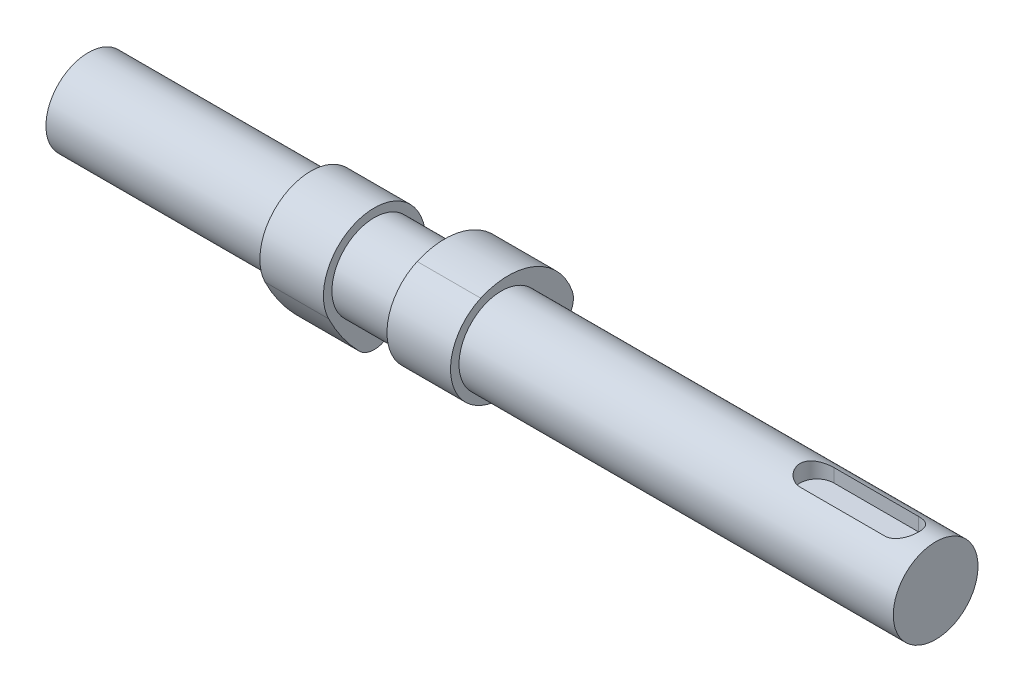
ISO-10303-21;
HEADER;
FILE_DESCRIPTION(('STEP AP214'),'2;1');
FILE_NAME('part.step','',(''),(''),'','','');
FILE_SCHEMA(('AUTOMOTIVE_DESIGN { 1 0 10303 214 1 1 1 1 }'));
ENDSEC;
DATA;
#1=APPLICATION_CONTEXT('core data for automotive mechanical design processes');
#2=APPLICATION_PROTOCOL_DEFINITION('international standard','automotive_design',2000,#1);
#3=PRODUCT_CONTEXT('',#1,'mechanical');
#4=PRODUCT('Part','Part','',(#3));
#5=PRODUCT_RELATED_PRODUCT_CATEGORY('part','',(#4));
#6=PRODUCT_DEFINITION_FORMATION('','',#4);
#7=PRODUCT_DEFINITION_CONTEXT('part definition',#1,'design');
#8=PRODUCT_DEFINITION('design','',#6,#7);
#9=PRODUCT_DEFINITION_SHAPE('','',#8);
#10=(LENGTH_UNIT() NAMED_UNIT(*) SI_UNIT(.MILLI.,.METRE.));
#11=(NAMED_UNIT(*) PLANE_ANGLE_UNIT() SI_UNIT($,.RADIAN.));
#12=(NAMED_UNIT(*) SI_UNIT($,.STERADIAN.) SOLID_ANGLE_UNIT());
#13=UNCERTAINTY_MEASURE_WITH_UNIT(LENGTH_MEASURE(1.E-05),#10,'distance_accuracy_value','');
#14=(GEOMETRIC_REPRESENTATION_CONTEXT(3) GLOBAL_UNCERTAINTY_ASSIGNED_CONTEXT((#13)) GLOBAL_UNIT_ASSIGNED_CONTEXT((#10,
#11,#12)) REPRESENTATION_CONTEXT('',''));
#15=CARTESIAN_POINT('',(0.,0.,0.));
#16=DIRECTION('',(0.,0.,1.));
#17=DIRECTION('',(1.,0.,0.));
#18=AXIS2_PLACEMENT_3D('',#15,#16,#17);
#19=CARTESIAN_POINT('',(-22.5,-1.62236318948023,3.65621904177246));
#20=DIRECTION('',(1.,0.,0.));
#21=DIRECTION('',(0.,1.,0.));
#22=AXIS2_PLACEMENT_3D('',#19,#20,#21);
#23=CYLINDRICAL_SURFACE('',#22,16.);
#24=CARTESIAN_POINT('',(-7.5,-1.62236318948023,3.65621904177246));
#25=DIRECTION('',(1.,0.,0.));
#26=DIRECTION('',(0.,1.,0.));
#27=AXIS2_PLACEMENT_3D('',#24,#25,#26);
#28=CIRCLE('',#27,16.);
#29=CARTESIAN_POINT('',(-7.5,-16.7126720366766,-1.66191774626015));
#30=VERTEX_POINT('',#29);
#31=CARTESIAN_POINT('',(-7.5,4.86708956844068,-10.9686571253174));
#32=VERTEX_POINT('',#31);
#33=EDGE_CURVE('E113',#30,#32,#28,.T.);
#34=ORIENTED_EDGE('',*,*,#33,.F.);
#35=DIRECTION('',(1.,0.,0.));
#36=VECTOR('',#35,1.);
#37=CARTESIAN_POINT('',(-22.5,-16.7126720366766,-1.66191774626015));
#38=LINE('',#37,#36);
#39=CARTESIAN_POINT('',(-22.5,-16.7126720366766,-1.66191774626015));
#40=VERTEX_POINT('',#39);
#41=EDGE_CURVE('E112',#40,#30,#38,.T.);
#42=ORIENTED_EDGE('',*,*,#41,.F.);
#43=CARTESIAN_POINT('',(-22.5,-1.62236318948023,3.65621904177246));
#44=DIRECTION('',(1.,0.,0.));
#45=DIRECTION('',(0.,1.,0.));
#46=AXIS2_PLACEMENT_3D('',#43,#44,#45);
#47=CIRCLE('',#46,16.);
#48=CARTESIAN_POINT('',(-22.5,4.86708956844068,-10.9686571253174));
#49=VERTEX_POINT('',#48);
#50=EDGE_CURVE('E107',#40,#49,#47,.T.);
#51=ORIENTED_EDGE('',*,*,#50,.T.);
#52=DIRECTION('',(1.,0.,0.));
#53=VECTOR('',#52,1.);
#54=CARTESIAN_POINT('',(-22.5,4.86708956844068,-10.9686571253174));
#55=LINE('',#54,#53);
#56=EDGE_CURVE('E12',#49,#32,#55,.T.);
#57=ORIENTED_EDGE('',*,*,#56,.T.);
#58=EDGE_LOOP('',(#34,#42,#51,#57));
#59=FACE_BOUND('',#58,.T.);
#60=ADVANCED_FACE('F50',(#59),#23,.T.);
#61=CARTESIAN_POINT('',(-22.5,0.,0.));
#62=DIRECTION('',(1.,0.,0.));
#63=DIRECTION('',(0.,1.,0.));
#64=AXIS2_PLACEMENT_3D('',#61,#62,#63);
#65=CYLINDRICAL_SURFACE('',#64,12.);
#66=CARTESIAN_POINT('',(-7.5,0.,0.));
#67=DIRECTION('',(1.,0.,0.));
#68=DIRECTION('',(0.,-1.,0.));
#69=AXIS2_PLACEMENT_3D('',#66,#67,#68);
#70=CIRCLE('',#69,12.);
#71=CARTESIAN_POINT('',(-7.5,-5.30622661682884,10.7630831591537));
#72=VERTEX_POINT('',#71);
#73=EDGE_CURVE('E115',#32,#72,#70,.T.);
#74=ORIENTED_EDGE('',*,*,#73,.F.);
#75=ORIENTED_EDGE('',*,*,#56,.F.);
#76=CARTESIAN_POINT('',(-22.5,0.,0.));
#77=DIRECTION('',(1.,0.,0.));
#78=DIRECTION('',(0.,-1.,0.));
#79=AXIS2_PLACEMENT_3D('',#76,#77,#78);
#80=CIRCLE('',#79,12.);
#81=CARTESIAN_POINT('',(-22.5,-5.30622661682884,10.7630831591537));
#82=VERTEX_POINT('',#81);
#83=EDGE_CURVE('E91',#49,#82,#80,.T.);
#84=ORIENTED_EDGE('',*,*,#83,.T.);
#85=DIRECTION('',(1.,0.,0.));
#86=VECTOR('',#85,1.);
#87=CARTESIAN_POINT('',(-22.5,-5.30622661682884,10.7630831591537));
#88=LINE('',#87,#86);
#89=EDGE_CURVE('E58',#82,#72,#88,.T.);
#90=ORIENTED_EDGE('',*,*,#89,.T.);
#91=EDGE_LOOP('',(#74,#75,#84,#90));
#92=FACE_BOUND('',#91,.T.);
#93=ADVANCED_FACE('F105',(#92),#65,.T.);
#94=CARTESIAN_POINT('',(-22.5,12.3811954392673,-25.1138607046919));
#95=DIRECTION('',(1.,0.,0.));
#96=DIRECTION('',(0.,1.,0.));
#97=AXIS2_PLACEMENT_3D('',#94,#95,#96);
#98=CYLINDRICAL_SURFACE('',#97,40.);
#99=CARTESIAN_POINT('',(-7.5,12.3811954392673,-25.1138607046919));
#100=DIRECTION('',(1.,0.,0.));
#101=DIRECTION('',(0.,-1.,0.));
#102=AXIS2_PLACEMENT_3D('',#99,#100,#101);
#103=CIRCLE('',#102,40.);
#104=CARTESIAN_POINT('',(-7.5,-15.4795428020985,3.58769438638459));
#105=VERTEX_POINT('',#104);
#106=EDGE_CURVE('E101',#72,#105,#103,.T.);
#107=ORIENTED_EDGE('',*,*,#106,.F.);
#108=ORIENTED_EDGE('',*,*,#89,.F.);
#109=CARTESIAN_POINT('',(-22.5,12.3811954392673,-25.1138607046919));
#110=DIRECTION('',(1.,0.,0.));
#111=DIRECTION('',(0.,-1.,0.));
#112=AXIS2_PLACEMENT_3D('',#109,#110,#111);
#113=CIRCLE('',#112,40.);
#114=CARTESIAN_POINT('',(-22.5,-15.4795428020985,3.58769438638459));
#115=VERTEX_POINT('',#114);
#116=EDGE_CURVE('E94',#82,#115,#113,.T.);
#117=ORIENTED_EDGE('',*,*,#116,.T.);
#118=DIRECTION('',(1.,0.,0.));
#119=VECTOR('',#118,1.);
#120=CARTESIAN_POINT('',(-22.5,-15.4795428020985,3.58769438638459));
#121=LINE('',#120,#119);
#122=EDGE_CURVE('E104',#115,#105,#121,.T.);
#123=ORIENTED_EDGE('',*,*,#122,.T.);
#124=EDGE_LOOP('',(#107,#108,#117,#123));
#125=FACE_BOUND('',#124,.T.);
#126=ADVANCED_FACE('F100',(#125),#98,.T.);
#127=CARTESIAN_POINT('',(-22.5,-11.9969505219278,0.));
#128=DIRECTION('',(1.,0.,0.));
#129=DIRECTION('',(0.,1.,0.));
#130=AXIS2_PLACEMENT_3D('',#127,#128,#129);
#131=CYLINDRICAL_SURFACE('',#130,5.);
#132=CARTESIAN_POINT('',(-7.5,-11.9969505219278,0.));
#133=DIRECTION('',(1.,0.,0.));
#134=DIRECTION('',(0.,-1.,0.));
#135=AXIS2_PLACEMENT_3D('',#132,#133,#134);
#136=CIRCLE('',#135,5.);
#137=EDGE_CURVE('E80',#105,#30,#136,.T.);
#138=ORIENTED_EDGE('',*,*,#137,.F.);
#139=ORIENTED_EDGE('',*,*,#122,.F.);
#140=CARTESIAN_POINT('',(-22.5,-11.9969505219278,0.));
#141=DIRECTION('',(1.,0.,0.));
#142=DIRECTION('',(0.,-1.,0.));
#143=AXIS2_PLACEMENT_3D('',#140,#141,#142);
#144=CIRCLE('',#143,5.);
#145=EDGE_CURVE('E66',#115,#40,#144,.T.);
#146=ORIENTED_EDGE('',*,*,#145,.T.);
#147=ORIENTED_EDGE('',*,*,#41,.T.);
#148=EDGE_LOOP('',(#138,#139,#146,#147));
#149=FACE_BOUND('',#148,.T.);
#150=ADVANCED_FACE('F124',(#149),#131,.T.);
#151=CARTESIAN_POINT('',(-22.5,-6.80965685570399,1.82810952088625));
#152=DIRECTION('',(1.,0.,0.));
#153=DIRECTION('',(0.,1.,0.));
#154=AXIS2_PLACEMENT_3D('',#151,#152,#153);
#155=PLANE('',#154);
#156=ORIENTED_EDGE('',*,*,#50,.F.);
#157=ORIENTED_EDGE('',*,*,#145,.F.);
#158=ORIENTED_EDGE('',*,*,#116,.F.);
#159=ORIENTED_EDGE('',*,*,#83,.F.);
#160=EDGE_LOOP('',(#156,#157,#158,#159));
#161=FACE_BOUND('',#160,.T.);
#162=ADVANCED_FACE('F96',(#161),#155,.F.);
#163=CARTESIAN_POINT('',(-7.5,-6.80965685570399,1.82810952088625));
#164=DIRECTION('',(1.,0.,0.));
#165=DIRECTION('',(0.,1.,0.));
#166=AXIS2_PLACEMENT_3D('',#163,#164,#165);
#167=PLANE('',#166);
#168=ORIENTED_EDGE('',*,*,#33,.T.);
#169=ORIENTED_EDGE('',*,*,#73,.T.);
#170=ORIENTED_EDGE('',*,*,#106,.T.);
#171=ORIENTED_EDGE('',*,*,#137,.T.);
#172=EDGE_LOOP('',(#168,#169,#170,#171));
#173=FACE_BOUND('',#172,.T.);
#174=ADVANCED_FACE('F120',(#173),#167,.T.);
#175=CLOSED_SHELL('',(#60,#93,#126,#150,#162,#174));
#176=MANIFOLD_SOLID_BREP('B2',#175);
#177=CARTESIAN_POINT('',(22.5,-3.65621904177246,-1.62236318948024));
#178=DIRECTION('',(-1.,0.,0.));
#179=DIRECTION('',(0.,0.,1.));
#180=AXIS2_PLACEMENT_3D('',#177,#178,#179);
#181=CYLINDRICAL_SURFACE('',#180,16.);
#182=CARTESIAN_POINT('',(7.5,-3.65621904177246,-1.62236318948024));
#183=DIRECTION('',(1.,0.,0.));
#184=DIRECTION('',(0.,0.,1.));
#185=AXIS2_PLACEMENT_3D('',#182,#183,#184);
#186=CIRCLE('',#185,16.);
#187=CARTESIAN_POINT('',(7.5,1.6619177462602,-16.7126720366766));
#188=VERTEX_POINT('',#187);
#189=CARTESIAN_POINT('',(7.5,10.9686571253174,4.86708956844072));
#190=VERTEX_POINT('',#189);
#191=EDGE_CURVE('E246',#188,#190,#186,.T.);
#192=ORIENTED_EDGE('',*,*,#191,.T.);
#193=DIRECTION('',(-1.,0.,0.));
#194=VECTOR('',#193,1.);
#195=CARTESIAN_POINT('',(22.5,10.9686571253174,4.86708956844072));
#196=LINE('',#195,#194);
#197=CARTESIAN_POINT('',(22.5,10.9686571253174,4.86708956844072));
#198=VERTEX_POINT('',#197);
#199=EDGE_CURVE('E48',#198,#190,#196,.T.);
#200=ORIENTED_EDGE('',*,*,#199,.F.);
#201=CARTESIAN_POINT('',(22.5,-3.65621904177246,-1.62236318948024));
#202=DIRECTION('',(1.,0.,0.));
#203=DIRECTION('',(0.,0.,1.));
#204=AXIS2_PLACEMENT_3D('',#201,#202,#203);
#205=CIRCLE('',#204,16.);
#206=CARTESIAN_POINT('',(22.5,1.6619177462602,-16.7126720366766));
#207=VERTEX_POINT('',#206);
#208=EDGE_CURVE('E234',#207,#198,#205,.T.);
#209=ORIENTED_EDGE('',*,*,#208,.F.);
#210=DIRECTION('',(-1.,0.,0.));
#211=VECTOR('',#210,1.);
#212=CARTESIAN_POINT('',(22.5,1.6619177462602,-16.7126720366766));
#213=LINE('',#212,#211);
#214=EDGE_CURVE('E242',#207,#188,#213,.T.);
#215=ORIENTED_EDGE('',*,*,#214,.T.);
#216=EDGE_LOOP('',(#192,#200,#209,#215));
#217=FACE_BOUND('',#216,.T.);
#218=ADVANCED_FACE('F183',(#217),#181,.T.);
#219=CARTESIAN_POINT('',(22.5,0.,0.));
#220=DIRECTION('',(-1.,0.,0.));
#221=DIRECTION('',(0.,0.,1.));
#222=AXIS2_PLACEMENT_3D('',#219,#220,#221);
#223=CYLINDRICAL_SURFACE('',#222,12.);
#224=CARTESIAN_POINT('',(7.5,0.,0.));
#225=DIRECTION('',(1.,0.,0.));
#226=DIRECTION('',(0.,0.,-1.));
#227=AXIS2_PLACEMENT_3D('',#224,#225,#226);
#228=CIRCLE('',#227,12.);
#229=CARTESIAN_POINT('',(7.5,-10.7630831591536,-5.30622661682888));
#230=VERTEX_POINT('',#229);
#231=EDGE_CURVE('E238',#190,#230,#228,.T.);
#232=ORIENTED_EDGE('',*,*,#231,.T.);
#233=DIRECTION('',(-1.,0.,0.));
#234=VECTOR('',#233,1.);
#235=CARTESIAN_POINT('',(22.5,-10.7630831591536,-5.30622661682888));
#236=LINE('',#235,#234);
#237=CARTESIAN_POINT('',(22.5,-10.7630831591536,-5.30622661682888));
#238=VERTEX_POINT('',#237);
#239=EDGE_CURVE('E191',#238,#230,#236,.T.);
#240=ORIENTED_EDGE('',*,*,#239,.F.);
#241=CARTESIAN_POINT('',(22.5,0.,0.));
#242=DIRECTION('',(1.,0.,0.));
#243=DIRECTION('',(0.,0.,-1.));
#244=AXIS2_PLACEMENT_3D('',#241,#242,#243);
#245=CIRCLE('',#244,12.);
#246=EDGE_CURVE('E229',#198,#238,#245,.T.);
#247=ORIENTED_EDGE('',*,*,#246,.F.);
#248=ORIENTED_EDGE('',*,*,#199,.T.);
#249=EDGE_LOOP('',(#232,#240,#247,#248));
#250=FACE_BOUND('',#249,.T.);
#251=ADVANCED_FACE('F237',(#250),#223,.T.);
#252=CARTESIAN_POINT('',(22.5,25.1138607046918,12.3811954392674));
#253=DIRECTION('',(-1.,0.,0.));
#254=DIRECTION('',(0.,0.,1.));
#255=AXIS2_PLACEMENT_3D('',#252,#253,#254);
#256=CYLINDRICAL_SURFACE('',#255,40.);
#257=CARTESIAN_POINT('',(7.5,25.1138607046918,12.3811954392674));
#258=DIRECTION('',(1.,0.,0.));
#259=DIRECTION('',(0.,0.,-1.));
#260=AXIS2_PLACEMENT_3D('',#257,#258,#259);
#261=CIRCLE('',#260,40.);
#262=CARTESIAN_POINT('',(7.5,-3.58769438638454,-15.4795428020985));
#263=VERTEX_POINT('',#262);
#264=EDGE_CURVE('E216',#230,#263,#261,.T.);
#265=ORIENTED_EDGE('',*,*,#264,.T.);
#266=DIRECTION('',(-1.,0.,0.));
#267=VECTOR('',#266,1.);
#268=CARTESIAN_POINT('',(22.5,-3.58769438638454,-15.4795428020985));
#269=LINE('',#268,#267);
#270=CARTESIAN_POINT('',(22.5,-3.58769438638454,-15.4795428020985));
#271=VERTEX_POINT('',#270);
#272=EDGE_CURVE('E239',#271,#263,#269,.T.);
#273=ORIENTED_EDGE('',*,*,#272,.F.);
#274=CARTESIAN_POINT('',(22.5,25.1138607046918,12.3811954392674));
#275=DIRECTION('',(1.,0.,0.));
#276=DIRECTION('',(0.,0.,-1.));
#277=AXIS2_PLACEMENT_3D('',#274,#275,#276);
#278=CIRCLE('',#277,40.);
#279=EDGE_CURVE('E232',#238,#271,#278,.T.);
#280=ORIENTED_EDGE('',*,*,#279,.F.);
#281=ORIENTED_EDGE('',*,*,#239,.T.);
#282=EDGE_LOOP('',(#265,#273,#280,#281));
#283=FACE_BOUND('',#282,.T.);
#284=ADVANCED_FACE('F240',(#283),#256,.T.);
#285=CARTESIAN_POINT('',(22.5,0.,-11.9969505219278));
#286=DIRECTION('',(-1.,0.,0.));
#287=DIRECTION('',(0.,0.,1.));
#288=AXIS2_PLACEMENT_3D('',#285,#286,#287);
#289=CYLINDRICAL_SURFACE('',#288,5.);
#290=CARTESIAN_POINT('',(7.5,0.,-11.9969505219278));
#291=DIRECTION('',(1.,0.,0.));
#292=DIRECTION('',(0.,0.,-1.));
#293=AXIS2_PLACEMENT_3D('',#290,#291,#292);
#294=CIRCLE('',#293,5.);
#295=EDGE_CURVE('E222',#263,#188,#294,.T.);
#296=ORIENTED_EDGE('',*,*,#295,.T.);
#297=ORIENTED_EDGE('',*,*,#214,.F.);
#298=CARTESIAN_POINT('',(22.5,0.,-11.9969505219278));
#299=DIRECTION('',(1.,0.,0.));
#300=DIRECTION('',(0.,0.,-1.));
#301=AXIS2_PLACEMENT_3D('',#298,#299,#300);
#302=CIRCLE('',#301,5.);
#303=EDGE_CURVE('E199',#271,#207,#302,.T.);
#304=ORIENTED_EDGE('',*,*,#303,.F.);
#305=ORIENTED_EDGE('',*,*,#272,.T.);
#306=EDGE_LOOP('',(#296,#297,#304,#305));
#307=FACE_BOUND('',#306,.T.);
#308=ADVANCED_FACE('F253',(#307),#289,.T.);
#309=CARTESIAN_POINT('',(22.5,-1.82810952088623,-6.809656855704));
#310=DIRECTION('',(-1.,0.,0.));
#311=DIRECTION('',(0.,0.,1.));
#312=AXIS2_PLACEMENT_3D('',#309,#310,#311);
#313=PLANE('',#312);
#314=ORIENTED_EDGE('',*,*,#208,.T.);
#315=ORIENTED_EDGE('',*,*,#246,.T.);
#316=ORIENTED_EDGE('',*,*,#279,.T.);
#317=ORIENTED_EDGE('',*,*,#303,.T.);
#318=EDGE_LOOP('',(#314,#315,#316,#317));
#319=FACE_BOUND('',#318,.T.);
#320=ADVANCED_FACE('F230',(#319),#313,.F.);
#321=CARTESIAN_POINT('',(7.5,-1.82810952088623,-6.809656855704));
#322=DIRECTION('',(-1.,0.,0.));
#323=DIRECTION('',(0.,0.,1.));
#324=AXIS2_PLACEMENT_3D('',#321,#322,#323);
#325=PLANE('',#324);
#326=ORIENTED_EDGE('',*,*,#191,.F.);
#327=ORIENTED_EDGE('',*,*,#295,.F.);
#328=ORIENTED_EDGE('',*,*,#264,.F.);
#329=ORIENTED_EDGE('',*,*,#231,.F.);
#330=EDGE_LOOP('',(#326,#327,#328,#329));
#331=FACE_BOUND('',#330,.T.);
#332=ADVANCED_FACE('F256',(#331),#325,.T.);
#333=CLOSED_SHELL('',(#218,#251,#284,#308,#320,#332));
#334=MANIFOLD_SOLID_BREP('B6',#333);
#335=CARTESIAN_POINT('',(125.,0.,0.));
#336=DIRECTION('',(-1.,0.,0.));
#337=DIRECTION('',(0.,0.,1.));
#338=AXIS2_PLACEMENT_3D('',#335,#336,#337);
#339=CYLINDRICAL_SURFACE('',#338,10.);
#340=DIRECTION('',(-1.,0.,0.));
#341=VECTOR('',#340,1.);
#342=CARTESIAN_POINT('',(125.,9.16515138991168,-4.));
#343=LINE('',#342,#341);
#344=CARTESIAN_POINT('',(97.,9.16515138991168,-4.));
#345=VERTEX_POINT('',#344);
#346=CARTESIAN_POINT('',(117.,9.16515138991168,-4.));
#347=VERTEX_POINT('',#346);
#348=EDGE_CURVE('E181',#345,#347,#343,.F.);
#349=ORIENTED_EDGE('',*,*,#348,.T.);
#350=CARTESIAN_POINT('',(117.,9.16515138991167,-4.00000000000002));
#351=CARTESIAN_POINT('',(117.107611705054,9.16512928809543,-4.00001596071939));
#352=CARTESIAN_POINT('',(117.215211331167,9.16704612011428,-3.99565782731267));
#353=CARTESIAN_POINT('',(117.429542596539,9.17459250745477,-3.97831811946461));
#354=CARTESIAN_POINT('',(117.536274550717,9.18022064873057,-3.96533982937532));
#355=CARTESIAN_POINT('',(117.747693643106,9.19499565865171,-3.93095207352901));
#356=CARTESIAN_POINT('',(117.852387168085,9.2041286144161,-3.90957593640918));
#357=CARTESIAN_POINT('',(118.059401543432,9.22560106586817,-3.85863260381274));
#358=CARTESIAN_POINT('',(118.161722248555,9.23794075728508,-3.82906490834149));
#359=CARTESIAN_POINT('',(118.463871701162,9.27918582501409,-3.72853943587113));
#360=CARTESIAN_POINT('',(118.659308461383,9.31234898316149,-3.64568978920224));
#361=CARTESIAN_POINT('',(119.033591160162,9.38624741529468,-3.45096383184149));
#362=CARTESIAN_POINT('',(119.212421105909,9.42698987727425,-3.33905992673096));
#363=CARTESIAN_POINT('',(119.558524793364,9.51401998804846,-3.08263671474508));
#364=CARTESIAN_POINT('',(119.7247344339,9.56048491272143,-2.93673827988503));
#365=CARTESIAN_POINT('',(120.031080544361,9.65225581096199,-2.6193929234938));
#366=CARTESIAN_POINT('',(120.171211661507,9.69756154495612,-2.44794076988));
#367=CARTESIAN_POINT('',(120.426812788624,9.78406834216144,-2.07601181629755));
#368=CARTESIAN_POINT('',(120.54108961941,9.82503649102095,-1.87465586655104));
#369=CARTESIAN_POINT('',(120.733688144491,9.89607888234979,-1.45364828604454));
#370=CARTESIAN_POINT('',(120.812024844793,9.92615767032247,-1.23400433637533));
#371=CARTESIAN_POINT('',(120.926682405771,9.97076629361036,-0.793934884187391));
#372=CARTESIAN_POINT('',(120.964853913303,9.98597845290694,-0.574062114869041));
#373=CARTESIAN_POINT('',(121.004056948403,10.001606202074,-0.130536855092222));
#374=CARTESIAN_POINT('',(121.005101633252,10.0020270338048,0.093114268252662));
#375=CARTESIAN_POINT('',(120.971034362072,9.98843920775428,0.524466731987217));
#376=CARTESIAN_POINT('',(120.937950053447,9.97523973659777,0.732358330632738));
#377=CARTESIAN_POINT('',(120.84001299909,9.93698538393897,1.13934964738687));
#378=CARTESIAN_POINT('',(120.77515845543,9.91192983148495,1.33844886722557));
#379=CARTESIAN_POINT('',(120.614727962228,9.85193670608706,1.72579479688347));
#380=CARTESIAN_POINT('',(120.518703604161,9.81685584875391,1.91383264586889));
#381=CARTESIAN_POINT('',(120.299068736295,9.74029168639969,2.27161599563069));
#382=CARTESIAN_POINT('',(120.175448548562,9.69880613681325,2.44135504792268));
#383=CARTESIAN_POINT('',(119.894719942564,9.61043706268123,2.76952257830688));
#384=CARTESIAN_POINT('',(119.735946982884,9.5633779574542,2.92647922614481));
#385=CARTESIAN_POINT('',(119.394007863337,9.47123359153047,3.21221470862618));
#386=CARTESIAN_POINT('',(119.2108306512,9.42614923753062,3.34098070594787));
#387=CARTESIAN_POINT('',(118.918364354377,9.36326134539255,3.51186134851387));
#388=CARTESIAN_POINT('',(118.816328161685,9.34283170142195,3.56571263251513));
#389=CARTESIAN_POINT('',(118.607607697591,9.30450957703986,3.66454761505657));
#390=CARTESIAN_POINT('',(118.500925454273,9.28661600381594,3.70953513634084));
#391=CARTESIAN_POINT('',(118.283771069504,9.25400250539921,3.79016254319006));
#392=CARTESIAN_POINT('',(118.173303829959,9.23927864276951,3.82581403809397));
#393=CARTESIAN_POINT('',(117.949331631851,9.21351467730911,3.88744848158462));
#394=CARTESIAN_POINT('',(117.835828059787,9.20247292309662,3.9134357650591));
#395=CARTESIAN_POINT('',(117.602554552662,9.18417798205495,3.95619393609844));
#396=CARTESIAN_POINT('',(117.482705805436,9.17707470750587,3.97260125584168));
#397=CARTESIAN_POINT('',(117.241909070863,9.16754485606458,3.99451448409731));
#398=CARTESIAN_POINT('',(117.120961807077,9.16511539745838,4.00002710996009));
#399=CARTESIAN_POINT('',(117.,9.16515138991169,3.99999999999999));
#400=B_SPLINE_CURVE_WITH_KNOTS('',3,(#350,#351,#352,#353,#354,#355,#356,#357,#358,#359,#360,
#361,#362,#363,#364,#365,#366,#367,#368,#369,#370,#371,#372,#373,#374,#375,#376,#377,#378,#379,
#380,#381,#382,#383,#384,#385,#386,#387,#388,#389,#390,#391,#392,#393,#394,#395,#396,#397,#398,
#399),.UNSPECIFIED.,.F.,.F.,(4,2,2,2,2,2,2,2,2,2,2,2,2,2,2,2,2,2,2,2,2,2,2,2,4),(0.,
0.322709706217834,0.645296527806424,0.966615822543774,1.28795473422461,1.92936600351818,
2.5713886988925,3.24636095994994,3.92147161082381,4.62325717855527,5.32474946398644,
5.99227753012539,6.65956903033311,7.2893783052307,7.91922322615308,8.55856353859093,
9.19812842270037,9.87963749353242,10.5614562641081,10.9125878460839,11.2635676597187,
11.614108935291,11.964492785171,12.3274303244848,12.6901440171997),.UNSPECIFIED.);
#401=CARTESIAN_POINT('',(117.,9.16515138991168,3.99999999999999));
#402=VERTEX_POINT('',#401);
#403=EDGE_CURVE('E393',#347,#402,#400,.T.);
#404=ORIENTED_EDGE('',*,*,#403,.T.);
#405=DIRECTION('',(-1.,0.,0.));
#406=VECTOR('',#405,1.);
#407=CARTESIAN_POINT('',(125.,9.16515138991168,4.));
#408=LINE('',#407,#406);
#409=CARTESIAN_POINT('',(97.,9.16515138991168,4.));
#410=VERTEX_POINT('',#409);
#411=EDGE_CURVE('E316',#402,#410,#408,.T.);
#412=ORIENTED_EDGE('',*,*,#411,.T.);
#413=CARTESIAN_POINT('',(97.,9.16515138991169,3.99999999999998));
#414=CARTESIAN_POINT('',(96.8923882949458,9.16512928809545,4.00001596071936));
#415=CARTESIAN_POINT('',(96.7847886688333,9.16704612011429,3.99565782731264));
#416=CARTESIAN_POINT('',(96.5704574034612,9.17459250745479,3.97831811946458));
#417=CARTESIAN_POINT('',(96.4637254492831,9.18022064873059,3.96533982937529));
#418=CARTESIAN_POINT('',(96.2523063568937,9.19499565865172,3.93095207352897));
#419=CARTESIAN_POINT('',(96.1476128319149,9.20412861441611,3.90957593640914));
#420=CARTESIAN_POINT('',(95.9405984565681,9.22560106586819,3.85863260381271));
#421=CARTESIAN_POINT('',(95.8382777514449,9.23794075728509,3.82906490834146));
#422=CARTESIAN_POINT('',(95.5361282988375,9.27918582501411,3.72853943587109));
#423=CARTESIAN_POINT('',(95.3406915386172,9.31234898316151,3.64568978920219));
#424=CARTESIAN_POINT('',(94.9664088398381,9.3862474152947,3.45096383184145));
#425=CARTESIAN_POINT('',(94.7875788940914,9.42698987727426,3.33905992673092));
#426=CARTESIAN_POINT('',(94.441475206636,9.51401998804847,3.08263671474504));
#427=CARTESIAN_POINT('',(94.2752655660996,9.56048491272144,2.93673827988499));
#428=CARTESIAN_POINT('',(93.9689194556385,9.652255810962,2.61939292349376));
#429=CARTESIAN_POINT('',(93.8287883384928,9.69756154495613,2.44794076987995));
#430=CARTESIAN_POINT('',(93.5731872113755,9.78406834216145,2.0760118162975));
#431=CARTESIAN_POINT('',(93.4589103805898,9.82503649102096,1.87465586655099));
#432=CARTESIAN_POINT('',(93.2663118555086,9.89607888234979,1.45364828604449));
#433=CARTESIAN_POINT('',(93.1879751552067,9.92615767032248,1.23400433637527));
#434=CARTESIAN_POINT('',(93.0733175942291,9.97076629361036,0.793934884187334));
#435=CARTESIAN_POINT('',(93.0351460866968,9.98597845290694,0.574062114868987));
#436=CARTESIAN_POINT('',(92.9959430515965,10.001606202074,0.130536855092173));
#437=CARTESIAN_POINT('',(92.9948983667482,10.0020270338048,-0.0931142682527085));
#438=CARTESIAN_POINT('',(93.0289656379282,9.98843920775428,-0.52446673198726));
#439=CARTESIAN_POINT('',(93.0620499465532,9.97523973659776,-0.732358330632781));
#440=CARTESIAN_POINT('',(93.1599870009102,9.93698538393896,-1.13934964738691));
#441=CARTESIAN_POINT('',(93.2248415445704,9.91192983148495,-1.33844886722561));
#442=CARTESIAN_POINT('',(93.3852720377719,9.85193670608706,-1.72579479688352));
#443=CARTESIAN_POINT('',(93.481296395839,9.8168558487539,-1.91383264586894));
#444=CARTESIAN_POINT('',(93.7009312637048,9.74029168639968,-2.27161599563073));
#445=CARTESIAN_POINT('',(93.8245514514379,9.69880613681323,-2.44135504792273));
#446=CARTESIAN_POINT('',(94.1052800574364,9.61043706268121,-2.76952257830693));
#447=CARTESIAN_POINT('',(94.2640530171164,9.56337795745418,-2.92647922614486));
#448=CARTESIAN_POINT('',(94.6059921366628,9.47123359153045,-3.21221470862623));
#449=CARTESIAN_POINT('',(94.7891693487996,9.4261492375306,-3.34098070594792));
#450=CARTESIAN_POINT('',(95.0816356456234,9.36326134539253,-3.51186134851392));
#451=CARTESIAN_POINT('',(95.1836718383149,9.34283170142193,-3.56571263251518));
#452=CARTESIAN_POINT('',(95.3923923024092,9.30450957703984,-3.66454761505662));
#453=CARTESIAN_POINT('',(95.4990745457273,9.28661600381592,-3.70953513634089));
#454=CARTESIAN_POINT('',(95.7162289304963,9.25400250539919,-3.7901625431901));
#455=CARTESIAN_POINT('',(95.8266961700414,9.23927864276949,-3.82581403809401));
#456=CARTESIAN_POINT('',(96.0506683681487,9.21351467730909,-3.88744848158466));
#457=CARTESIAN_POINT('',(96.1641719402126,9.20247292309661,-3.91343576505914));
#458=CARTESIAN_POINT('',(96.3974454473375,9.18417798205494,-3.95619393609848));
#459=CARTESIAN_POINT('',(96.5172941945638,9.17707470750586,-3.97260125584172));
#460=CARTESIAN_POINT('',(96.758090929137,9.16754485606457,-3.99451448409734));
#461=CARTESIAN_POINT('',(96.8790381929227,9.16511539745837,-4.00002710996012));
#462=CARTESIAN_POINT('',(97.,9.16515138991167,-4.00000000000002));
#463=B_SPLINE_CURVE_WITH_KNOTS('',3,(#413,#414,#415,#416,#417,#418,#419,#420,#421,#422,#423,
#424,#425,#426,#427,#428,#429,#430,#431,#432,#433,#434,#435,#436,#437,#438,#439,#440,#441,#442,
#443,#444,#445,#446,#447,#448,#449,#450,#451,#452,#453,#454,#455,#456,#457,#458,#459,#460,#461,
#462),.UNSPECIFIED.,.F.,.F.,(4,2,2,2,2,2,2,2,2,2,2,2,2,2,2,2,2,2,2,2,2,2,2,2,4),(0.,
0.322709706217834,0.645296527806424,0.966615822543774,1.28795473422463,1.9293660035182,
2.57138869889252,3.24636095994996,3.92147161082383,4.62325717855529,5.32474946398647,
5.99227753012541,6.65956903033312,7.28937830523071,7.9192232261531,8.55856353859094,
9.19812842270039,9.87963749353246,10.5614562641081,10.9125878460839,11.2635676597188,
11.614108935291,11.964492785171,12.3274303244848,12.6901440171997),.UNSPECIFIED.);
#464=EDGE_CURVE('E323',#410,#345,#463,.T.);
#465=ORIENTED_EDGE('',*,*,#464,.T.);
#466=EDGE_LOOP('',(#349,#404,#412,#465));
#467=FACE_BOUND('',#466,.T.);
#468=CARTESIAN_POINT('',(125.,0.,0.));
#469=DIRECTION('',(1.,0.,0.));
#470=DIRECTION('',(0.,0.,-1.));
#471=AXIS2_PLACEMENT_3D('',#468,#469,#470);
#472=CIRCLE('',#471,10.);
#473=CARTESIAN_POINT('',(125.,0.,-10.));
#474=VERTEX_POINT('',#473);
#475=EDGE_CURVE('E389',#474,#474,#472,.T.);
#476=ORIENTED_EDGE('',*,*,#475,.F.);
#477=EDGE_LOOP('',(#476));
#478=FACE_BOUND('',#477,.T.);
#479=CARTESIAN_POINT('',(-75.,0.,0.));
#480=DIRECTION('',(1.,0.,0.));
#481=DIRECTION('',(0.,0.,-1.));
#482=AXIS2_PLACEMENT_3D('',#479,#480,#481);
#483=CIRCLE('',#482,10.);
#484=CARTESIAN_POINT('',(-75.,0.,-10.));
#485=VERTEX_POINT('',#484);
#486=EDGE_CURVE('E380',#485,#485,#483,.T.);
#487=ORIENTED_EDGE('',*,*,#486,.T.);
#488=EDGE_LOOP('',(#487));
#489=FACE_BOUND('',#488,.T.);
#490=ADVANCED_FACE('F307',(#467,#478,#489),#339,.T.);
#491=CARTESIAN_POINT('',(125.,0.,0.));
#492=DIRECTION('',(1.,0.,0.));
#493=DIRECTION('',(0.,0.,-1.));
#494=AXIS2_PLACEMENT_3D('',#491,#492,#493);
#495=PLANE('',#494);
#496=ORIENTED_EDGE('',*,*,#475,.T.);
#497=EDGE_LOOP('',(#496));
#498=FACE_BOUND('',#497,.T.);
#499=ADVANCED_FACE('F421',(#498),#495,.T.);
#500=CARTESIAN_POINT('',(-75.,0.,0.));
#501=DIRECTION('',(1.,0.,0.));
#502=DIRECTION('',(0.,0.,-1.));
#503=AXIS2_PLACEMENT_3D('',#500,#501,#502);
#504=PLANE('',#503);
#505=ORIENTED_EDGE('',*,*,#486,.F.);
#506=EDGE_LOOP('',(#505));
#507=FACE_BOUND('',#506,.T.);
#508=ADVANCED_FACE('F419',(#507),#504,.F.);
#509=CARTESIAN_POINT('',(97.,6.,0.));
#510=DIRECTION('',(0.,1.,0.));
#511=DIRECTION('',(0.,0.,1.));
#512=AXIS2_PLACEMENT_3D('',#509,#510,#511);
#513=CYLINDRICAL_SURFACE('',#512,4.);
#514=DIRECTION('',(0.,1.,0.));
#515=VECTOR('',#514,1.);
#516=CARTESIAN_POINT('',(97.,6.,4.));
#517=LINE('',#516,#515);
#518=CARTESIAN_POINT('',(97.,6.,4.));
#519=VERTEX_POINT('',#518);
#520=EDGE_CURVE('E346',#519,#410,#517,.T.);
#521=ORIENTED_EDGE('',*,*,#520,.F.);
#522=CARTESIAN_POINT('',(97.,6.,0.));
#523=DIRECTION('',(0.,1.,0.));
#524=DIRECTION('',(0.,0.,1.));
#525=AXIS2_PLACEMENT_3D('',#522,#523,#524);
#526=CIRCLE('',#525,4.);
#527=CARTESIAN_POINT('',(97.,6.,-4.));
#528=VERTEX_POINT('',#527);
#529=EDGE_CURVE('E350',#528,#519,#526,.T.);
#530=ORIENTED_EDGE('',*,*,#529,.F.);
#531=DIRECTION('',(0.,1.,0.));
#532=VECTOR('',#531,1.);
#533=CARTESIAN_POINT('',(97.,6.,-4.));
#534=LINE('',#533,#532);
#535=EDGE_CURVE('E377',#528,#345,#534,.T.);
#536=ORIENTED_EDGE('',*,*,#535,.T.);
#537=ORIENTED_EDGE('',*,*,#464,.F.);
#538=EDGE_LOOP('',(#521,#530,#536,#537));
#539=FACE_BOUND('',#538,.T.);
#540=ADVANCED_FACE('F348',(#539),#513,.F.);
#541=CARTESIAN_POINT('',(97.,6.,-4.));
#542=DIRECTION('',(0.,0.,-1.));
#543=DIRECTION('',(-1.,0.,0.));
#544=AXIS2_PLACEMENT_3D('',#541,#542,#543);
#545=PLANE('',#544);
#546=ORIENTED_EDGE('',*,*,#535,.F.);
#547=DIRECTION('',(-1.,0.,0.));
#548=VECTOR('',#547,1.);
#549=CARTESIAN_POINT('',(97.,6.,-4.));
#550=LINE('',#549,#548);
#551=CARTESIAN_POINT('',(117.,6.,-4.));
#552=VERTEX_POINT('',#551);
#553=EDGE_CURVE('E356',#552,#528,#550,.T.);
#554=ORIENTED_EDGE('',*,*,#553,.F.);
#555=DIRECTION('',(0.,1.,0.));
#556=VECTOR('',#555,1.);
#557=CARTESIAN_POINT('',(117.,6.,-4.));
#558=LINE('',#557,#556);
#559=EDGE_CURVE('E381',#552,#347,#558,.T.);
#560=ORIENTED_EDGE('',*,*,#559,.T.);
#561=ORIENTED_EDGE('',*,*,#348,.F.);
#562=EDGE_LOOP('',(#546,#554,#560,#561));
#563=FACE_BOUND('',#562,.T.);
#564=ADVANCED_FACE('F412',(#563),#545,.F.);
#565=CARTESIAN_POINT('',(117.,6.,0.));
#566=DIRECTION('',(0.,1.,0.));
#567=DIRECTION('',(0.,0.,1.));
#568=AXIS2_PLACEMENT_3D('',#565,#566,#567);
#569=CYLINDRICAL_SURFACE('',#568,4.);
#570=ORIENTED_EDGE('',*,*,#559,.F.);
#571=CARTESIAN_POINT('',(117.,6.,0.));
#572=DIRECTION('',(0.,1.,0.));
#573=DIRECTION('',(0.,0.,1.));
#574=AXIS2_PLACEMENT_3D('',#571,#572,#573);
#575=CIRCLE('',#574,4.);
#576=CARTESIAN_POINT('',(117.,6.,3.99999999999999));
#577=VERTEX_POINT('',#576);
#578=EDGE_CURVE('E366',#577,#552,#575,.T.);
#579=ORIENTED_EDGE('',*,*,#578,.F.);
#580=DIRECTION('',(0.,1.,0.));
#581=VECTOR('',#580,1.);
#582=CARTESIAN_POINT('',(117.,6.,3.99999999999999));
#583=LINE('',#582,#581);
#584=EDGE_CURVE('E355',#577,#402,#583,.T.);
#585=ORIENTED_EDGE('',*,*,#584,.T.);
#586=ORIENTED_EDGE('',*,*,#403,.F.);
#587=EDGE_LOOP('',(#570,#579,#585,#586));
#588=FACE_BOUND('',#587,.T.);
#589=ADVANCED_FACE('F407',(#588),#569,.F.);
#590=CARTESIAN_POINT('',(97.,6.,4.));
#591=DIRECTION('',(0.,0.,1.));
#592=DIRECTION('',(1.,0.,0.));
#593=AXIS2_PLACEMENT_3D('',#590,#591,#592);
#594=PLANE('',#593);
#595=ORIENTED_EDGE('',*,*,#584,.F.);
#596=DIRECTION('',(1.,0.,0.));
#597=VECTOR('',#596,1.);
#598=CARTESIAN_POINT('',(97.,6.,4.));
#599=LINE('',#598,#597);
#600=EDGE_CURVE('E359',#519,#577,#599,.T.);
#601=ORIENTED_EDGE('',*,*,#600,.F.);
#602=ORIENTED_EDGE('',*,*,#520,.T.);
#603=ORIENTED_EDGE('',*,*,#411,.F.);
#604=EDGE_LOOP('',(#595,#601,#602,#603));
#605=FACE_BOUND('',#604,.T.);
#606=ADVANCED_FACE('F360',(#605),#594,.F.);
#607=CARTESIAN_POINT('',(97.,6.,0.));
#608=DIRECTION('',(0.,1.,0.));
#609=DIRECTION('',(0.,0.,1.));
#610=AXIS2_PLACEMENT_3D('',#607,#608,#609);
#611=PLANE('',#610);
#612=ORIENTED_EDGE('',*,*,#529,.T.);
#613=ORIENTED_EDGE('',*,*,#600,.T.);
#614=ORIENTED_EDGE('',*,*,#578,.T.);
#615=ORIENTED_EDGE('',*,*,#553,.T.);
#616=EDGE_LOOP('',(#612,#613,#614,#615));
#617=FACE_BOUND('',#616,.T.);
#618=ADVANCED_FACE('F368',(#617),#611,.T.);
#619=CLOSED_SHELL('',(#490,#499,#508,#540,#564,#589,#606,#618));
#620=MANIFOLD_SOLID_BREP('B42',#619);
#621=ADVANCED_BREP_SHAPE_REPRESENTATION('',(#18,#176,#334,#620),#14);
#622=SHAPE_DEFINITION_REPRESENTATION(#9,#621);
ENDSEC;
END-ISO-10303-21;
